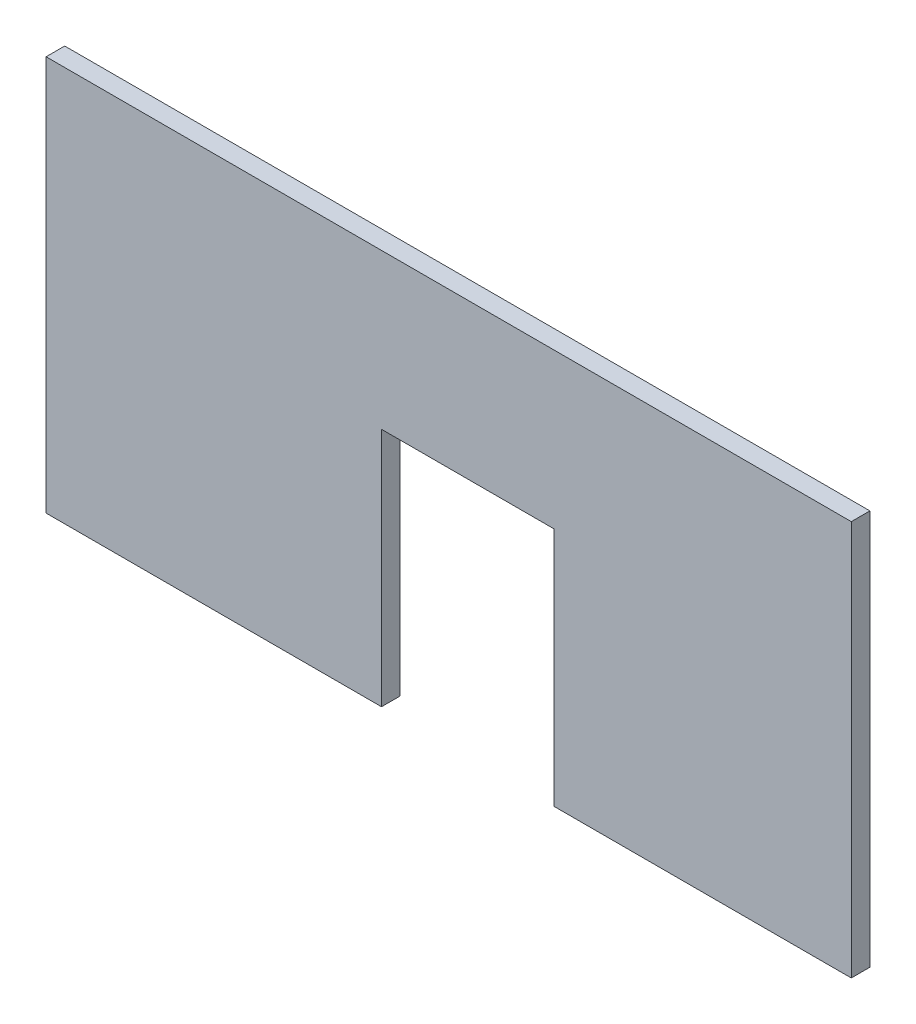
ISO-10303-21;
HEADER;
FILE_DESCRIPTION(('STEP AP214'),'2;1');
FILE_NAME('part.step','',(''),(''),'','','');
FILE_SCHEMA(('AUTOMOTIVE_DESIGN { 1 0 10303 214 1 1 1 1 }'));
ENDSEC;
DATA;
#1=APPLICATION_CONTEXT('core data for automotive mechanical design processes');
#2=APPLICATION_PROTOCOL_DEFINITION('international standard','automotive_design',2000,#1);
#3=PRODUCT_CONTEXT('',#1,'mechanical');
#4=PRODUCT('Part','Part','',(#3));
#5=PRODUCT_RELATED_PRODUCT_CATEGORY('part','',(#4));
#6=PRODUCT_DEFINITION_FORMATION('','',#4);
#7=PRODUCT_DEFINITION_CONTEXT('part definition',#1,'design');
#8=PRODUCT_DEFINITION('design','',#6,#7);
#9=PRODUCT_DEFINITION_SHAPE('','',#8);
#10=(LENGTH_UNIT() NAMED_UNIT(*) SI_UNIT(.MILLI.,.METRE.));
#11=(NAMED_UNIT(*) PLANE_ANGLE_UNIT() SI_UNIT($,.RADIAN.));
#12=(NAMED_UNIT(*) SI_UNIT($,.STERADIAN.) SOLID_ANGLE_UNIT());
#13=UNCERTAINTY_MEASURE_WITH_UNIT(LENGTH_MEASURE(1.E-05),#10,'distance_accuracy_value','');
#14=(GEOMETRIC_REPRESENTATION_CONTEXT(3) GLOBAL_UNCERTAINTY_ASSIGNED_CONTEXT((#13)) GLOBAL_UNIT_ASSIGNED_CONTEXT((#10,
#11,#12)) REPRESENTATION_CONTEXT('',''));
#15=CARTESIAN_POINT('',(0.,0.,0.));
#16=DIRECTION('',(0.,0.,1.));
#17=DIRECTION('',(1.,0.,0.));
#18=AXIS2_PLACEMENT_3D('',#15,#16,#17);
#19=CARTESIAN_POINT('',(216.535268781183,1576.48548739758,58.));
#20=DIRECTION('',(-1.,0.,0.));
#21=DIRECTION('',(0.,0.,1.));
#22=AXIS2_PLACEMENT_3D('',#19,#20,#21);
#23=PLANE('',#22);
#24=DIRECTION('',(0.,1.,0.));
#25=VECTOR('',#24,1.);
#26=CARTESIAN_POINT('',(216.535268781183,1576.48548739758,48.));
#27=LINE('',#26,#25);
#28=CARTESIAN_POINT('',(216.535268781183,1576.48548739758,48.));
#29=VERTEX_POINT('',#28);
#30=CARTESIAN_POINT('',(216.535268781183,1788.73842257682,48.));
#31=VERTEX_POINT('',#30);
#32=EDGE_CURVE('E133',#29,#31,#27,.T.);
#33=ORIENTED_EDGE('',*,*,#32,.T.);
#34=DIRECTION('',(0.,0.,-1.));
#35=VECTOR('',#34,1.);
#36=CARTESIAN_POINT('',(216.535268781183,1788.73842257682,58.));
#37=LINE('',#36,#35);
#38=CARTESIAN_POINT('',(216.535268781183,1788.73842257682,58.));
#39=VERTEX_POINT('',#38);
#40=EDGE_CURVE('E11',#39,#31,#37,.T.);
#41=ORIENTED_EDGE('',*,*,#40,.F.);
#42=DIRECTION('',(0.,1.,0.));
#43=VECTOR('',#42,1.);
#44=CARTESIAN_POINT('',(216.535268781183,1576.48548739758,58.));
#45=LINE('',#44,#43);
#46=CARTESIAN_POINT('',(216.535268781183,1576.48548739758,58.));
#47=VERTEX_POINT('',#46);
#48=EDGE_CURVE('E147',#47,#39,#45,.T.);
#49=ORIENTED_EDGE('',*,*,#48,.F.);
#50=DIRECTION('',(0.,0.,-1.));
#51=VECTOR('',#50,1.);
#52=CARTESIAN_POINT('',(216.535268781183,1576.48548739758,58.));
#53=LINE('',#52,#51);
#54=EDGE_CURVE('E129',#47,#29,#53,.T.);
#55=ORIENTED_EDGE('',*,*,#54,.T.);
#56=EDGE_LOOP('',(#33,#41,#49,#55));
#57=FACE_BOUND('',#56,.T.);
#58=ADVANCED_FACE('F37',(#57),#23,.F.);
#59=CARTESIAN_POINT('',(216.535268781183,1788.73842257682,58.));
#60=DIRECTION('',(0.,-1.,0.));
#61=DIRECTION('',(0.,0.,-1.));
#62=AXIS2_PLACEMENT_3D('',#59,#60,#61);
#63=PLANE('',#62);
#64=DIRECTION('',(-1.,0.,0.));
#65=VECTOR('',#64,1.);
#66=CARTESIAN_POINT('',(216.535268781183,1788.73842257682,48.));
#67=LINE('',#66,#65);
#68=CARTESIAN_POINT('',(-215.875298803013,1788.73842257682,48.));
#69=VERTEX_POINT('',#68);
#70=EDGE_CURVE('E136',#31,#69,#67,.T.);
#71=ORIENTED_EDGE('',*,*,#70,.T.);
#72=DIRECTION('',(0.,0.,-1.));
#73=VECTOR('',#72,1.);
#74=CARTESIAN_POINT('',(-215.875298803013,1788.73842257682,58.));
#75=LINE('',#74,#73);
#76=CARTESIAN_POINT('',(-215.875298803013,1788.73842257682,58.));
#77=VERTEX_POINT('',#76);
#78=EDGE_CURVE('E45',#77,#69,#75,.T.);
#79=ORIENTED_EDGE('',*,*,#78,.F.);
#80=DIRECTION('',(-1.,0.,0.));
#81=VECTOR('',#80,1.);
#82=CARTESIAN_POINT('',(216.535268781183,1788.73842257682,58.));
#83=LINE('',#82,#81);
#84=EDGE_CURVE('E96',#39,#77,#83,.T.);
#85=ORIENTED_EDGE('',*,*,#84,.F.);
#86=ORIENTED_EDGE('',*,*,#40,.T.);
#87=EDGE_LOOP('',(#71,#79,#85,#86));
#88=FACE_BOUND('',#87,.T.);
#89=ADVANCED_FACE('F182',(#88),#63,.F.);
#90=CARTESIAN_POINT('',(-215.875298803013,1576.48548739758,58.));
#91=DIRECTION('',(1.,0.,0.));
#92=DIRECTION('',(0.,0.,-1.));
#93=AXIS2_PLACEMENT_3D('',#90,#91,#92);
#94=PLANE('',#93);
#95=DIRECTION('',(0.,-1.,0.));
#96=VECTOR('',#95,1.);
#97=CARTESIAN_POINT('',(-215.875298803013,1576.48548739758,48.));
#98=LINE('',#97,#96);
#99=CARTESIAN_POINT('',(-215.875298803013,1576.48548739758,48.));
#100=VERTEX_POINT('',#99);
#101=EDGE_CURVE('E138',#69,#100,#98,.T.);
#102=ORIENTED_EDGE('',*,*,#101,.T.);
#103=DIRECTION('',(0.,0.,-1.));
#104=VECTOR('',#103,1.);
#105=CARTESIAN_POINT('',(-215.875298803013,1576.48548739758,58.));
#106=LINE('',#105,#104);
#107=CARTESIAN_POINT('',(-215.875298803013,1576.48548739758,58.));
#108=VERTEX_POINT('',#107);
#109=EDGE_CURVE('E154',#108,#100,#106,.T.);
#110=ORIENTED_EDGE('',*,*,#109,.F.);
#111=DIRECTION('',(0.,-1.,0.));
#112=VECTOR('',#111,1.);
#113=CARTESIAN_POINT('',(-215.875298803013,1576.48548739758,58.));
#114=LINE('',#113,#112);
#115=EDGE_CURVE('E162',#77,#108,#114,.T.);
#116=ORIENTED_EDGE('',*,*,#115,.F.);
#117=ORIENTED_EDGE('',*,*,#78,.T.);
#118=EDGE_LOOP('',(#102,#110,#116,#117));
#119=FACE_BOUND('',#118,.T.);
#120=ADVANCED_FACE('F160',(#119),#94,.F.);
#121=CARTESIAN_POINT('',(-35.7512479023913,1576.48548739758,58.));
#122=DIRECTION('',(0.,1.,0.));
#123=DIRECTION('',(0.,0.,1.));
#124=AXIS2_PLACEMENT_3D('',#121,#122,#123);
#125=PLANE('',#124);
#126=DIRECTION('',(1.,0.,0.));
#127=VECTOR('',#126,1.);
#128=CARTESIAN_POINT('',(-35.7512479023913,1576.48548739758,48.));
#129=LINE('',#128,#127);
#130=CARTESIAN_POINT('',(-35.7512479023913,1576.48548739758,48.));
#131=VERTEX_POINT('',#130);
#132=EDGE_CURVE('E140',#100,#131,#129,.T.);
#133=ORIENTED_EDGE('',*,*,#132,.T.);
#134=DIRECTION('',(0.,0.,-1.));
#135=VECTOR('',#134,1.);
#136=CARTESIAN_POINT('',(-35.7512479023913,1576.48548739758,58.));
#137=LINE('',#136,#135);
#138=CARTESIAN_POINT('',(-35.7512479023913,1576.48548739758,58.));
#139=VERTEX_POINT('',#138);
#140=EDGE_CURVE('E151',#139,#131,#137,.T.);
#141=ORIENTED_EDGE('',*,*,#140,.F.);
#142=DIRECTION('',(1.,0.,0.));
#143=VECTOR('',#142,1.);
#144=CARTESIAN_POINT('',(-35.7512479023913,1576.48548739758,58.));
#145=LINE('',#144,#143);
#146=EDGE_CURVE('E174',#108,#139,#145,.T.);
#147=ORIENTED_EDGE('',*,*,#146,.F.);
#148=ORIENTED_EDGE('',*,*,#109,.T.);
#149=EDGE_LOOP('',(#133,#141,#147,#148));
#150=FACE_BOUND('',#149,.T.);
#151=ADVANCED_FACE('F170',(#150),#125,.F.);
#152=CARTESIAN_POINT('',(-35.7512479023913,1576.48548739758,58.));
#153=DIRECTION('',(-1.,0.,0.));
#154=DIRECTION('',(0.,0.,1.));
#155=AXIS2_PLACEMENT_3D('',#152,#153,#154);
#156=PLANE('',#155);
#157=DIRECTION('',(0.,1.,0.));
#158=VECTOR('',#157,1.);
#159=CARTESIAN_POINT('',(-35.7512479023913,1576.48548739758,48.));
#160=LINE('',#159,#158);
#161=CARTESIAN_POINT('',(-35.7512479023913,1705.54291316471,48.));
#162=VERTEX_POINT('',#161);
#163=EDGE_CURVE('E142',#131,#162,#160,.T.);
#164=ORIENTED_EDGE('',*,*,#163,.T.);
#165=DIRECTION('',(0.,0.,-1.));
#166=VECTOR('',#165,1.);
#167=CARTESIAN_POINT('',(-35.7512479023913,1705.54291316471,58.));
#168=LINE('',#167,#166);
#169=CARTESIAN_POINT('',(-35.7512479023913,1705.54291316471,58.));
#170=VERTEX_POINT('',#169);
#171=EDGE_CURVE('E124',#170,#162,#168,.T.);
#172=ORIENTED_EDGE('',*,*,#171,.F.);
#173=DIRECTION('',(0.,1.,0.));
#174=VECTOR('',#173,1.);
#175=CARTESIAN_POINT('',(-35.7512479023913,1576.48548739758,58.));
#176=LINE('',#175,#174);
#177=EDGE_CURVE('E115',#139,#170,#176,.T.);
#178=ORIENTED_EDGE('',*,*,#177,.F.);
#179=ORIENTED_EDGE('',*,*,#140,.T.);
#180=EDGE_LOOP('',(#164,#172,#178,#179));
#181=FACE_BOUND('',#180,.T.);
#182=ADVANCED_FACE('F173',(#181),#156,.F.);
#183=CARTESIAN_POINT('',(-35.7512479023913,1705.54291316471,58.));
#184=DIRECTION('',(0.,1.,0.));
#185=DIRECTION('',(0.,0.,1.));
#186=AXIS2_PLACEMENT_3D('',#183,#184,#185);
#187=PLANE('',#186);
#188=DIRECTION('',(1.,0.,0.));
#189=VECTOR('',#188,1.);
#190=CARTESIAN_POINT('',(-35.7512479023913,1705.54291316471,48.));
#191=LINE('',#190,#189);
#192=CARTESIAN_POINT('',(56.9828769987826,1705.54291316471,48.));
#193=VERTEX_POINT('',#192);
#194=EDGE_CURVE('E123',#162,#193,#191,.T.);
#195=ORIENTED_EDGE('',*,*,#194,.T.);
#196=DIRECTION('',(0.,0.,-1.));
#197=VECTOR('',#196,1.);
#198=CARTESIAN_POINT('',(56.9828769987826,1705.54291316471,58.));
#199=LINE('',#198,#197);
#200=CARTESIAN_POINT('',(56.9828769987826,1705.54291316471,58.));
#201=VERTEX_POINT('',#200);
#202=EDGE_CURVE('E120',#201,#193,#199,.T.);
#203=ORIENTED_EDGE('',*,*,#202,.F.);
#204=DIRECTION('',(1.,0.,0.));
#205=VECTOR('',#204,1.);
#206=CARTESIAN_POINT('',(-35.7512479023913,1705.54291316471,58.));
#207=LINE('',#206,#205);
#208=EDGE_CURVE('E109',#170,#201,#207,.T.);
#209=ORIENTED_EDGE('',*,*,#208,.F.);
#210=ORIENTED_EDGE('',*,*,#171,.T.);
#211=EDGE_LOOP('',(#195,#203,#209,#210));
#212=FACE_BOUND('',#211,.T.);
#213=ADVANCED_FACE('F121',(#212),#187,.F.);
#214=CARTESIAN_POINT('',(56.9828769987826,1705.54291316471,58.));
#215=DIRECTION('',(1.,0.,0.));
#216=DIRECTION('',(0.,1.,0.));
#217=AXIS2_PLACEMENT_3D('',#214,#215,#216);
#218=PLANE('',#217);
#219=DIRECTION('',(0.,-1.,0.));
#220=VECTOR('',#219,1.);
#221=CARTESIAN_POINT('',(56.9828769987826,1705.54291316471,48.));
#222=LINE('',#221,#220);
#223=CARTESIAN_POINT('',(56.9828769987826,1576.48548739758,48.));
#224=VERTEX_POINT('',#223);
#225=EDGE_CURVE('E82',#193,#224,#222,.T.);
#226=ORIENTED_EDGE('',*,*,#225,.T.);
#227=DIRECTION('',(0.,0.,-1.));
#228=VECTOR('',#227,1.);
#229=CARTESIAN_POINT('',(56.9828769987826,1576.48548739758,58.));
#230=LINE('',#229,#228);
#231=CARTESIAN_POINT('',(56.9828769987826,1576.48548739758,58.));
#232=VERTEX_POINT('',#231);
#233=EDGE_CURVE('E125',#232,#224,#230,.T.);
#234=ORIENTED_EDGE('',*,*,#233,.F.);
#235=DIRECTION('',(0.,-1.,0.));
#236=VECTOR('',#235,1.);
#237=CARTESIAN_POINT('',(56.9828769987826,1705.54291316471,58.));
#238=LINE('',#237,#236);
#239=EDGE_CURVE('E113',#201,#232,#238,.T.);
#240=ORIENTED_EDGE('',*,*,#239,.F.);
#241=ORIENTED_EDGE('',*,*,#202,.T.);
#242=EDGE_LOOP('',(#226,#234,#240,#241));
#243=FACE_BOUND('',#242,.T.);
#244=ADVANCED_FACE('F127',(#243),#218,.F.);
#245=CARTESIAN_POINT('',(216.535268781183,1576.48548739758,58.));
#246=DIRECTION('',(0.,1.,0.));
#247=DIRECTION('',(0.,0.,1.));
#248=AXIS2_PLACEMENT_3D('',#245,#246,#247);
#249=PLANE('',#248);
#250=DIRECTION('',(1.,0.,0.));
#251=VECTOR('',#250,1.);
#252=CARTESIAN_POINT('',(216.535268781183,1576.48548739758,48.));
#253=LINE('',#252,#251);
#254=EDGE_CURVE('E88',#224,#29,#253,.T.);
#255=ORIENTED_EDGE('',*,*,#254,.T.);
#256=ORIENTED_EDGE('',*,*,#54,.F.);
#257=DIRECTION('',(1.,0.,0.));
#258=VECTOR('',#257,1.);
#259=CARTESIAN_POINT('',(216.535268781183,1576.48548739758,58.));
#260=LINE('',#259,#258);
#261=EDGE_CURVE('E53',#232,#47,#260,.T.);
#262=ORIENTED_EDGE('',*,*,#261,.F.);
#263=ORIENTED_EDGE('',*,*,#233,.T.);
#264=EDGE_LOOP('',(#255,#256,#262,#263));
#265=FACE_BOUND('',#264,.T.);
#266=ADVANCED_FACE('F198',(#265),#249,.F.);
#267=CARTESIAN_POINT('',(0.,0.,58.));
#268=DIRECTION('',(0.,0.,1.));
#269=DIRECTION('',(1.,0.,0.));
#270=AXIS2_PLACEMENT_3D('',#267,#268,#269);
#271=PLANE('',#270);
#272=ORIENTED_EDGE('',*,*,#48,.T.);
#273=ORIENTED_EDGE('',*,*,#84,.T.);
#274=ORIENTED_EDGE('',*,*,#115,.T.);
#275=ORIENTED_EDGE('',*,*,#146,.T.);
#276=ORIENTED_EDGE('',*,*,#177,.T.);
#277=ORIENTED_EDGE('',*,*,#208,.T.);
#278=ORIENTED_EDGE('',*,*,#239,.T.);
#279=ORIENTED_EDGE('',*,*,#261,.T.);
#280=EDGE_LOOP('',(#272,#273,#274,#275,#276,#277,#278,#279));
#281=FACE_BOUND('',#280,.T.);
#282=ADVANCED_FACE('F111',(#281),#271,.T.);
#283=CARTESIAN_POINT('',(0.,0.,48.));
#284=DIRECTION('',(0.,0.,1.));
#285=DIRECTION('',(1.,0.,0.));
#286=AXIS2_PLACEMENT_3D('',#283,#284,#285);
#287=PLANE('',#286);
#288=ORIENTED_EDGE('',*,*,#32,.F.);
#289=ORIENTED_EDGE('',*,*,#254,.F.);
#290=ORIENTED_EDGE('',*,*,#225,.F.);
#291=ORIENTED_EDGE('',*,*,#194,.F.);
#292=ORIENTED_EDGE('',*,*,#163,.F.);
#293=ORIENTED_EDGE('',*,*,#132,.F.);
#294=ORIENTED_EDGE('',*,*,#101,.F.);
#295=ORIENTED_EDGE('',*,*,#70,.F.);
#296=EDGE_LOOP('',(#288,#289,#290,#291,#292,#293,#294,#295));
#297=FACE_BOUND('',#296,.T.);
#298=ADVANCED_FACE('F166',(#297),#287,.F.);
#299=CLOSED_SHELL('',(#58,#89,#120,#151,#182,#213,#244,#266,#282,#298));
#300=MANIFOLD_SOLID_BREP('B2',#299);
#301=ADVANCED_BREP_SHAPE_REPRESENTATION('',(#18,#300),#14);
#302=SHAPE_DEFINITION_REPRESENTATION(#9,#301);
ENDSEC;
END-ISO-10303-21;
